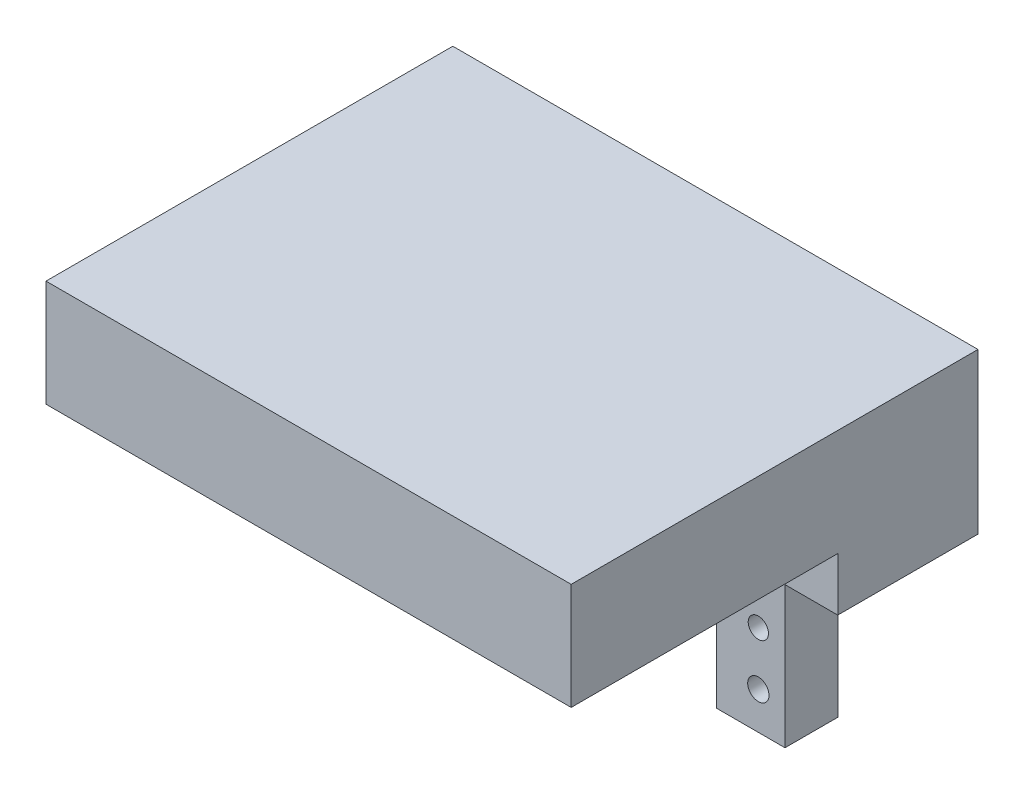
ISO-10303-21;
HEADER;
FILE_DESCRIPTION(('STEP AP214'),'2;1');
FILE_NAME('part.step','',(''),(''),'','','');
FILE_SCHEMA(('AUTOMOTIVE_DESIGN { 1 0 10303 214 1 1 1 1 }'));
ENDSEC;
DATA;
#1=APPLICATION_CONTEXT('core data for automotive mechanical design processes');
#2=APPLICATION_PROTOCOL_DEFINITION('international standard','automotive_design',2000,#1);
#3=PRODUCT_CONTEXT('',#1,'mechanical');
#4=PRODUCT('Part','Part','',(#3));
#5=PRODUCT_RELATED_PRODUCT_CATEGORY('part','',(#4));
#6=PRODUCT_DEFINITION_FORMATION('','',#4);
#7=PRODUCT_DEFINITION_CONTEXT('part definition',#1,'design');
#8=PRODUCT_DEFINITION('design','',#6,#7);
#9=PRODUCT_DEFINITION_SHAPE('','',#8);
#10=(LENGTH_UNIT() NAMED_UNIT(*) SI_UNIT(.MILLI.,.METRE.));
#11=(NAMED_UNIT(*) PLANE_ANGLE_UNIT() SI_UNIT($,.RADIAN.));
#12=(NAMED_UNIT(*) SI_UNIT($,.STERADIAN.) SOLID_ANGLE_UNIT());
#13=UNCERTAINTY_MEASURE_WITH_UNIT(LENGTH_MEASURE(1.E-05),#10,'distance_accuracy_value','');
#14=(GEOMETRIC_REPRESENTATION_CONTEXT(3) GLOBAL_UNCERTAINTY_ASSIGNED_CONTEXT((#13)) GLOBAL_UNIT_ASSIGNED_CONTEXT((#10,
#11,#12)) REPRESENTATION_CONTEXT('',''));
#15=CARTESIAN_POINT('',(0.,0.,0.));
#16=DIRECTION('',(0.,0.,1.));
#17=DIRECTION('',(1.,0.,0.));
#18=AXIS2_PLACEMENT_3D('',#15,#16,#17);
#19=CARTESIAN_POINT('',(-11.4021016393443,7.62,1.06117868852459));
#20=DIRECTION('',(0.,0.,-1.));
#21=DIRECTION('',(-1.,0.,0.));
#22=AXIS2_PLACEMENT_3D('',#19,#20,#21);
#23=PLANE('',#22);
#24=CARTESIAN_POINT('',(9.83229836065573,-4.953,1.06117868852459));
#25=DIRECTION('',(0.,0.,1.));
#26=DIRECTION('',(1.,0.,0.));
#27=AXIS2_PLACEMENT_3D('',#24,#25,#26);
#28=CIRCLE('',#27,0.508);
#29=CARTESIAN_POINT('',(10.3402983606557,-4.953,1.06117868852459));
#30=VERTEX_POINT('',#29);
#31=EDGE_CURVE('E184',#30,#30,#28,.T.);
#32=ORIENTED_EDGE('',*,*,#31,.F.);
#33=EDGE_LOOP('',(#32));
#34=FACE_BOUND('',#33,.T.);
#35=CARTESIAN_POINT('',(9.83229836065573,-2.413,1.06117868852459));
#36=DIRECTION('',(0.,0.,1.));
#37=DIRECTION('',(1.,0.,0.));
#38=AXIS2_PLACEMENT_3D('',#35,#36,#37);
#39=CIRCLE('',#38,0.482599999999999);
#40=CARTESIAN_POINT('',(10.3148983606557,-2.413,1.06117868852459));
#41=VERTEX_POINT('',#40);
#42=EDGE_CURVE('E203',#41,#41,#39,.T.);
#43=ORIENTED_EDGE('',*,*,#42,.F.);
#44=EDGE_LOOP('',(#43));
#45=FACE_BOUND('',#44,.T.);
#46=CARTESIAN_POINT('',(-6.34750163934426,-0.762,1.06117868852459));
#47=DIRECTION('',(0.,0.,1.));
#48=DIRECTION('',(1.,0.,0.));
#49=AXIS2_PLACEMENT_3D('',#46,#47,#48);
#50=CIRCLE('',#49,1.5748);
#51=CARTESIAN_POINT('',(-4.77270163934426,-0.762,1.06117868852459));
#52=VERTEX_POINT('',#51);
#53=EDGE_CURVE('E198',#52,#52,#50,.T.);
#54=ORIENTED_EDGE('',*,*,#53,.F.);
#55=EDGE_LOOP('',(#54));
#56=FACE_BOUND('',#55,.T.);
#57=DIRECTION('',(1.,0.,0.));
#58=VECTOR('',#57,1.);
#59=CARTESIAN_POINT('',(-11.4021016393443,2.54,1.06117868852459));
#60=LINE('',#59,#58);
#61=CARTESIAN_POINT('',(-11.4021016393443,2.54,1.06117868852459));
#62=VERTEX_POINT('',#61);
#63=CARTESIAN_POINT('',(13.6168983606557,2.54,1.06117868852459));
#64=VERTEX_POINT('',#63);
#65=EDGE_CURVE('E55',#62,#64,#60,.T.);
#66=ORIENTED_EDGE('',*,*,#65,.F.);
#67=DIRECTION('',(0.,-1.,0.));
#68=VECTOR('',#67,1.);
#69=CARTESIAN_POINT('',(-11.4021016393443,7.62,1.06117868852459));
#70=LINE('',#69,#68);
#71=CARTESIAN_POINT('',(-11.4021016393443,0.,1.06117868852459));
#72=VERTEX_POINT('',#71);
#73=EDGE_CURVE('E182',#62,#72,#70,.T.);
#74=ORIENTED_EDGE('',*,*,#73,.T.);
#75=DIRECTION('',(1.,0.,0.));
#76=VECTOR('',#75,1.);
#77=CARTESIAN_POINT('',(-11.4021016393443,0.,1.06117868852459));
#78=LINE('',#77,#76);
#79=CARTESIAN_POINT('',(-8.88750163934426,0.,1.06117868852459));
#80=VERTEX_POINT('',#79);
#81=EDGE_CURVE('E335',#72,#80,#78,.T.);
#82=ORIENTED_EDGE('',*,*,#81,.T.);
#83=DIRECTION('',(0.,1.,0.));
#84=VECTOR('',#83,1.);
#85=CARTESIAN_POINT('',(-8.88750163934426,-6.731,1.06117868852459));
#86=LINE('',#85,#84);
#87=CARTESIAN_POINT('',(-8.88750163934426,-6.731,1.06117868852459));
#88=VERTEX_POINT('',#87);
#89=EDGE_CURVE('E257',#88,#80,#86,.T.);
#90=ORIENTED_EDGE('',*,*,#89,.F.);
#91=DIRECTION('',(-1.,0.,0.));
#92=VECTOR('',#91,1.);
#93=CARTESIAN_POINT('',(-8.88750163934426,-6.731,1.06117868852459));
#94=LINE('',#93,#92);
#95=CARTESIAN_POINT('',(-0.251501639344265,-6.731,1.06117868852459));
#96=VERTEX_POINT('',#95);
#97=EDGE_CURVE('E252',#96,#88,#94,.T.);
#98=ORIENTED_EDGE('',*,*,#97,.F.);
#99=DIRECTION('',(0.,-1.,0.));
#100=VECTOR('',#99,1.);
#101=CARTESIAN_POINT('',(-0.251501639344266,7.62,1.06117868852459));
#102=LINE('',#101,#100);
#103=CARTESIAN_POINT('',(-0.251501639344265,0.,1.06117868852459));
#104=VERTEX_POINT('',#103);
#105=EDGE_CURVE('E232',#104,#96,#102,.T.);
#106=ORIENTED_EDGE('',*,*,#105,.F.);
#107=DIRECTION('',(-1.,0.,0.));
#108=VECTOR('',#107,1.);
#109=CARTESIAN_POINT('',(-11.4021016393443,0.,1.06117868852459));
#110=LINE('',#109,#108);
#111=CARTESIAN_POINT('',(7.85109836065573,0.,1.06117868852459));
#112=VERTEX_POINT('',#111);
#113=EDGE_CURVE('E235',#112,#104,#110,.T.);
#114=ORIENTED_EDGE('',*,*,#113,.F.);
#115=DIRECTION('',(0.,1.,0.));
#116=VECTOR('',#115,1.);
#117=CARTESIAN_POINT('',(7.85109836065573,7.62,1.06117868852459));
#118=LINE('',#117,#116);
#119=CARTESIAN_POINT('',(7.85109836065573,-6.731,1.06117868852459));
#120=VERTEX_POINT('',#119);
#121=EDGE_CURVE('E229',#120,#112,#118,.T.);
#122=ORIENTED_EDGE('',*,*,#121,.F.);
#123=CARTESIAN_POINT('',(11.1022983606557,-6.731,1.06117868852459));
#124=VERTEX_POINT('',#123);
#125=EDGE_CURVE('E253',#124,#120,#94,.T.);
#126=ORIENTED_EDGE('',*,*,#125,.F.);
#127=DIRECTION('',(0.,1.,0.));
#128=VECTOR('',#127,1.);
#129=CARTESIAN_POINT('',(11.1022983606557,-6.731,1.06117868852459));
#130=LINE('',#129,#128);
#131=CARTESIAN_POINT('',(11.1022983606557,0.,1.06117868852459));
#132=VERTEX_POINT('',#131);
#133=EDGE_CURVE('E267',#124,#132,#130,.T.);
#134=ORIENTED_EDGE('',*,*,#133,.T.);
#135=CARTESIAN_POINT('',(13.6168983606557,0.,1.06117868852459));
#136=VERTEX_POINT('',#135);
#137=EDGE_CURVE('E334',#132,#136,#78,.T.);
#138=ORIENTED_EDGE('',*,*,#137,.T.);
#139=DIRECTION('',(0.,-1.,0.));
#140=VECTOR('',#139,1.);
#141=CARTESIAN_POINT('',(13.6168983606557,7.62,1.06117868852459));
#142=LINE('',#141,#140);
#143=EDGE_CURVE('E351',#64,#136,#142,.T.);
#144=ORIENTED_EDGE('',*,*,#143,.F.);
#145=EDGE_LOOP('',(#66,#74,#82,#90,#98,#106,#114,#122,#126,#134,#138,#144));
#146=FACE_BOUND('',#145,.T.);
#147=ADVANCED_FACE('F39',(#34,#45,#56,#146),#23,.F.);
#148=CARTESIAN_POINT('',(-8.88750163934426,1.778,-1.45342131147541));
#149=DIRECTION('',(0.,0.,1.));
#150=DIRECTION('',(1.,0.,0.));
#151=AXIS2_PLACEMENT_3D('',#148,#149,#150);
#152=PLANE('',#151);
#153=CARTESIAN_POINT('',(-6.34750163934426,-0.762,-1.45342131147541));
#154=DIRECTION('',(0.,0.,1.));
#155=DIRECTION('',(1.,0.,0.));
#156=AXIS2_PLACEMENT_3D('',#153,#154,#155);
#157=CIRCLE('',#156,1.5748);
#158=CARTESIAN_POINT('',(-4.77270163934426,-0.762,-1.45342131147541));
#159=VERTEX_POINT('',#158);
#160=EDGE_CURVE('E194',#159,#159,#157,.F.);
#161=ORIENTED_EDGE('',*,*,#160,.F.);
#162=EDGE_LOOP('',(#161));
#163=FACE_BOUND('',#162,.T.);
#164=CARTESIAN_POINT('',(9.83229836065573,-2.413,-1.45342131147541));
#165=DIRECTION('',(0.,0.,1.));
#166=DIRECTION('',(1.,0.,0.));
#167=AXIS2_PLACEMENT_3D('',#164,#165,#166);
#168=CIRCLE('',#167,0.482599999999999);
#169=CARTESIAN_POINT('',(10.3148983606557,-2.413,-1.45342131147541));
#170=VERTEX_POINT('',#169);
#171=EDGE_CURVE('E202',#170,#170,#168,.F.);
#172=ORIENTED_EDGE('',*,*,#171,.F.);
#173=EDGE_LOOP('',(#172));
#174=FACE_BOUND('',#173,.T.);
#175=CARTESIAN_POINT('',(9.83229836065573,-4.953,-1.45342131147541));
#176=DIRECTION('',(0.,0.,1.));
#177=DIRECTION('',(1.,0.,0.));
#178=AXIS2_PLACEMENT_3D('',#175,#176,#177);
#179=CIRCLE('',#178,0.508);
#180=CARTESIAN_POINT('',(10.3402983606557,-4.953,-1.45342131147541));
#181=VERTEX_POINT('',#180);
#182=EDGE_CURVE('E189',#181,#181,#179,.F.);
#183=ORIENTED_EDGE('',*,*,#182,.F.);
#184=EDGE_LOOP('',(#183));
#185=FACE_BOUND('',#184,.T.);
#186=DIRECTION('',(0.,1.,0.));
#187=VECTOR('',#186,1.);
#188=CARTESIAN_POINT('',(-0.251501639344265,-6.731,-1.45342131147541));
#189=LINE('',#188,#187);
#190=CARTESIAN_POINT('',(-0.251501639344265,-6.731,-1.45342131147541));
#191=VERTEX_POINT('',#190);
#192=CARTESIAN_POINT('',(-0.251501639344265,0.,-1.45342131147541));
#193=VERTEX_POINT('',#192);
#194=EDGE_CURVE('E219',#191,#193,#189,.T.);
#195=ORIENTED_EDGE('',*,*,#194,.F.);
#196=DIRECTION('',(1.,0.,0.));
#197=VECTOR('',#196,1.);
#198=CARTESIAN_POINT('',(-8.88750163934426,-6.731,-1.45342131147541));
#199=LINE('',#198,#197);
#200=CARTESIAN_POINT('',(-8.88750163934426,-6.731,-1.45342131147541));
#201=VERTEX_POINT('',#200);
#202=EDGE_CURVE('E245',#201,#191,#199,.T.);
#203=ORIENTED_EDGE('',*,*,#202,.F.);
#204=DIRECTION('',(0.,1.,0.));
#205=VECTOR('',#204,1.);
#206=CARTESIAN_POINT('',(-8.88750163934426,-6.731,-1.45342131147541));
#207=LINE('',#206,#205);
#208=CARTESIAN_POINT('',(-8.88750163934426,0.,-1.45342131147541));
#209=VERTEX_POINT('',#208);
#210=EDGE_CURVE('E275',#201,#209,#207,.T.);
#211=ORIENTED_EDGE('',*,*,#210,.T.);
#212=DIRECTION('',(0.,-1.,0.));
#213=VECTOR('',#212,1.);
#214=CARTESIAN_POINT('',(-8.88750163934426,1.778,-1.45342131147541));
#215=LINE('',#214,#213);
#216=CARTESIAN_POINT('',(-8.88750163934426,1.778,-1.45342131147541));
#217=VERTEX_POINT('',#216);
#218=EDGE_CURVE('E315',#217,#209,#215,.T.);
#219=ORIENTED_EDGE('',*,*,#218,.F.);
#220=DIRECTION('',(-1.,0.,0.));
#221=VECTOR('',#220,1.);
#222=CARTESIAN_POINT('',(-8.88750163934426,1.778,-1.45342131147541));
#223=LINE('',#222,#221);
#224=CARTESIAN_POINT('',(11.1022983606557,1.778,-1.45342131147541));
#225=VERTEX_POINT('',#224);
#226=EDGE_CURVE('E284',#225,#217,#223,.T.);
#227=ORIENTED_EDGE('',*,*,#226,.F.);
#228=DIRECTION('',(0.,-1.,0.));
#229=VECTOR('',#228,1.);
#230=CARTESIAN_POINT('',(11.1022983606557,1.778,-1.45342131147541));
#231=LINE('',#230,#229);
#232=CARTESIAN_POINT('',(11.1022983606557,0.,-1.45342131147541));
#233=VERTEX_POINT('',#232);
#234=EDGE_CURVE('E297',#225,#233,#231,.T.);
#235=ORIENTED_EDGE('',*,*,#234,.T.);
#236=DIRECTION('',(0.,1.,0.));
#237=VECTOR('',#236,1.);
#238=CARTESIAN_POINT('',(11.1022983606557,-6.731,-1.45342131147541));
#239=LINE('',#238,#237);
#240=CARTESIAN_POINT('',(11.1022983606557,-6.731,-1.45342131147541));
#241=VERTEX_POINT('',#240);
#242=EDGE_CURVE('E271',#241,#233,#239,.T.);
#243=ORIENTED_EDGE('',*,*,#242,.F.);
#244=CARTESIAN_POINT('',(7.85109836065573,-6.731,-1.45342131147541));
#245=VERTEX_POINT('',#244);
#246=EDGE_CURVE('E243',#245,#241,#199,.T.);
#247=ORIENTED_EDGE('',*,*,#246,.F.);
#248=DIRECTION('',(0.,-1.,0.));
#249=VECTOR('',#248,1.);
#250=CARTESIAN_POINT('',(7.85109836065573,-6.731,-1.45342131147541));
#251=LINE('',#250,#249);
#252=CARTESIAN_POINT('',(7.85109836065573,0.,-1.45342131147541));
#253=VERTEX_POINT('',#252);
#254=EDGE_CURVE('E63',#253,#245,#251,.T.);
#255=ORIENTED_EDGE('',*,*,#254,.F.);
#256=DIRECTION('',(1.,0.,0.));
#257=VECTOR('',#256,1.);
#258=CARTESIAN_POINT('',(-0.251501639344265,0.,-1.45342131147541));
#259=LINE('',#258,#257);
#260=EDGE_CURVE('E215',#193,#253,#259,.T.);
#261=ORIENTED_EDGE('',*,*,#260,.F.);
#262=EDGE_LOOP('',(#195,#203,#211,#219,#227,#235,#243,#247,#255,#261));
#263=FACE_BOUND('',#262,.T.);
#264=ADVANCED_FACE('F412',(#163,#174,#185,#263),#152,.F.);
#265=CARTESIAN_POINT('',(0.,-6.731,0.));
#266=DIRECTION('',(0.,1.,0.));
#267=DIRECTION('',(0.,0.,1.));
#268=AXIS2_PLACEMENT_3D('',#265,#266,#267);
#269=PLANE('',#268);
#270=DIRECTION('',(0.,0.,-1.));
#271=VECTOR('',#270,1.);
#272=CARTESIAN_POINT('',(-0.251501639344265,-6.731,0.));
#273=LINE('',#272,#271);
#274=EDGE_CURVE('E11',#96,#191,#273,.T.);
#275=ORIENTED_EDGE('',*,*,#274,.F.);
#276=ORIENTED_EDGE('',*,*,#97,.T.);
#277=DIRECTION('',(0.,0.,-1.));
#278=VECTOR('',#277,1.);
#279=CARTESIAN_POINT('',(-8.88750163934426,-6.731,-1.45342131147541));
#280=LINE('',#279,#278);
#281=EDGE_CURVE('E239',#88,#201,#280,.T.);
#282=ORIENTED_EDGE('',*,*,#281,.T.);
#283=ORIENTED_EDGE('',*,*,#202,.T.);
#284=EDGE_LOOP('',(#275,#276,#282,#283));
#285=FACE_BOUND('',#284,.T.);
#286=ADVANCED_FACE('F401',(#285),#269,.F.);
#287=DIRECTION('',(0.,0.,1.));
#288=VECTOR('',#287,1.);
#289=CARTESIAN_POINT('',(7.85109836065573,-6.731,0.));
#290=LINE('',#289,#288);
#291=EDGE_CURVE('E48',#245,#120,#290,.T.);
#292=ORIENTED_EDGE('',*,*,#291,.F.);
#293=ORIENTED_EDGE('',*,*,#246,.T.);
#294=DIRECTION('',(0.,0.,1.));
#295=VECTOR('',#294,1.);
#296=CARTESIAN_POINT('',(11.1022983606557,-6.731,-1.45342131147541));
#297=LINE('',#296,#295);
#298=EDGE_CURVE('E249',#241,#124,#297,.T.);
#299=ORIENTED_EDGE('',*,*,#298,.T.);
#300=ORIENTED_EDGE('',*,*,#125,.T.);
#301=EDGE_LOOP('',(#292,#293,#299,#300));
#302=FACE_BOUND('',#301,.T.);
#303=ADVANCED_FACE('F364',(#302),#269,.F.);
#304=CARTESIAN_POINT('',(0.,0.,0.));
#305=DIRECTION('',(0.,1.,0.));
#306=DIRECTION('',(0.,0.,1.));
#307=AXIS2_PLACEMENT_3D('',#304,#305,#306);
#308=PLANE('',#307);
#309=DIRECTION('',(0.,0.,-1.));
#310=VECTOR('',#309,1.);
#311=CARTESIAN_POINT('',(-8.88750163934426,0.,-1.45342131147541));
#312=LINE('',#311,#310);
#313=EDGE_CURVE('E238',#80,#209,#312,.T.);
#314=ORIENTED_EDGE('',*,*,#313,.F.);
#315=ORIENTED_EDGE('',*,*,#81,.F.);
#316=DIRECTION('',(0.,0.,1.));
#317=VECTOR('',#316,1.);
#318=CARTESIAN_POINT('',(-11.4021016393443,0.,-5.61902131147541));
#319=LINE('',#318,#317);
#320=CARTESIAN_POINT('',(-11.4021016393443,0.,-5.61902131147541));
#321=VERTEX_POINT('',#320);
#322=EDGE_CURVE('E311',#321,#72,#319,.T.);
#323=ORIENTED_EDGE('',*,*,#322,.F.);
#324=DIRECTION('',(-1.,0.,0.));
#325=VECTOR('',#324,1.);
#326=CARTESIAN_POINT('',(-11.4021016393443,0.,-5.61902131147541));
#327=LINE('',#326,#325);
#328=CARTESIAN_POINT('',(13.6168983606557,0.,-5.61902131147541));
#329=VERTEX_POINT('',#328);
#330=EDGE_CURVE('E325',#329,#321,#327,.T.);
#331=ORIENTED_EDGE('',*,*,#330,.F.);
#332=DIRECTION('',(0.,0.,-1.));
#333=VECTOR('',#332,1.);
#334=CARTESIAN_POINT('',(13.6168983606557,0.,-5.61902131147541));
#335=LINE('',#334,#333);
#336=EDGE_CURVE('E339',#136,#329,#335,.T.);
#337=ORIENTED_EDGE('',*,*,#336,.F.);
#338=ORIENTED_EDGE('',*,*,#137,.F.);
#339=DIRECTION('',(0.,0.,1.));
#340=VECTOR('',#339,1.);
#341=CARTESIAN_POINT('',(11.1022983606557,0.,-1.45342131147541));
#342=LINE('',#341,#340);
#343=EDGE_CURVE('E244',#233,#132,#342,.T.);
#344=ORIENTED_EDGE('',*,*,#343,.F.);
#345=DIRECTION('',(0.,0.,1.));
#346=VECTOR('',#345,1.);
#347=CARTESIAN_POINT('',(11.1022983606557,0.,-3.10442131147541));
#348=LINE('',#347,#346);
#349=CARTESIAN_POINT('',(11.1022983606557,0.,-3.10442131147541));
#350=VERTEX_POINT('',#349);
#351=EDGE_CURVE('E279',#350,#233,#348,.T.);
#352=ORIENTED_EDGE('',*,*,#351,.F.);
#353=DIRECTION('',(1.,0.,0.));
#354=VECTOR('',#353,1.);
#355=CARTESIAN_POINT('',(-8.88750163934426,0.,-3.10442131147541));
#356=LINE('',#355,#354);
#357=CARTESIAN_POINT('',(-8.88750163934426,0.,-3.10442131147541));
#358=VERTEX_POINT('',#357);
#359=EDGE_CURVE('E285',#358,#350,#356,.T.);
#360=ORIENTED_EDGE('',*,*,#359,.F.);
#361=DIRECTION('',(0.,0.,-1.));
#362=VECTOR('',#361,1.);
#363=CARTESIAN_POINT('',(-8.88750163934426,0.,-3.10442131147541));
#364=LINE('',#363,#362);
#365=EDGE_CURVE('E301',#209,#358,#364,.T.);
#366=ORIENTED_EDGE('',*,*,#365,.F.);
#367=EDGE_LOOP('',(#314,#315,#323,#331,#337,#338,#344,#352,#360,#366));
#368=FACE_BOUND('',#367,.T.);
#369=ADVANCED_FACE('F375',(#368),#308,.F.);
#370=CARTESIAN_POINT('',(-11.4021016393443,7.62,-5.61902131147541));
#371=DIRECTION('',(1.,0.,0.));
#372=DIRECTION('',(0.,0.,-1.));
#373=AXIS2_PLACEMENT_3D('',#370,#371,#372);
#374=PLANE('',#373);
#375=ORIENTED_EDGE('',*,*,#322,.T.);
#376=ORIENTED_EDGE('',*,*,#73,.F.);
#377=DIRECTION('',(0.,0.,-1.));
#378=VECTOR('',#377,1.);
#379=CARTESIAN_POINT('',(-11.4021016393443,2.54,13.7611786885246));
#380=LINE('',#379,#378);
#381=CARTESIAN_POINT('',(-11.4021016393443,2.54,13.7611786885246));
#382=VERTEX_POINT('',#381);
#383=EDGE_CURVE('E162',#382,#62,#380,.T.);
#384=ORIENTED_EDGE('',*,*,#383,.F.);
#385=DIRECTION('',(0.,-1.,0.));
#386=VECTOR('',#385,1.);
#387=CARTESIAN_POINT('',(-11.4021016393443,7.62,13.7611786885246));
#388=LINE('',#387,#386);
#389=CARTESIAN_POINT('',(-11.4021016393443,7.62,13.7611786885246));
#390=VERTEX_POINT('',#389);
#391=EDGE_CURVE('E170',#390,#382,#388,.T.);
#392=ORIENTED_EDGE('',*,*,#391,.F.);
#393=DIRECTION('',(0.,0.,1.));
#394=VECTOR('',#393,1.);
#395=CARTESIAN_POINT('',(-11.4021016393443,7.62,-5.61902131147541));
#396=LINE('',#395,#394);
#397=CARTESIAN_POINT('',(-11.4021016393443,7.62,-5.61902131147541));
#398=VERTEX_POINT('',#397);
#399=EDGE_CURVE('E321',#398,#390,#396,.T.);
#400=ORIENTED_EDGE('',*,*,#399,.F.);
#401=DIRECTION('',(0.,-1.,0.));
#402=VECTOR('',#401,1.);
#403=CARTESIAN_POINT('',(-11.4021016393443,7.62,-5.61902131147541));
#404=LINE('',#403,#402);
#405=EDGE_CURVE('E331',#398,#321,#404,.T.);
#406=ORIENTED_EDGE('',*,*,#405,.T.);
#407=EDGE_LOOP('',(#375,#376,#384,#392,#400,#406));
#408=FACE_BOUND('',#407,.T.);
#409=ADVANCED_FACE('F41',(#408),#374,.F.);
#410=CARTESIAN_POINT('',(13.6168983606557,7.62,-5.61902131147541));
#411=DIRECTION('',(-1.,0.,0.));
#412=DIRECTION('',(0.,0.,1.));
#413=AXIS2_PLACEMENT_3D('',#410,#411,#412);
#414=PLANE('',#413);
#415=ORIENTED_EDGE('',*,*,#336,.T.);
#416=DIRECTION('',(0.,-1.,0.));
#417=VECTOR('',#416,1.);
#418=CARTESIAN_POINT('',(13.6168983606557,7.62,-5.61902131147541));
#419=LINE('',#418,#417);
#420=CARTESIAN_POINT('',(13.6168983606557,7.62,-5.61902131147541));
#421=VERTEX_POINT('',#420);
#422=EDGE_CURVE('E347',#421,#329,#419,.T.);
#423=ORIENTED_EDGE('',*,*,#422,.F.);
#424=DIRECTION('',(0.,0.,-1.));
#425=VECTOR('',#424,1.);
#426=CARTESIAN_POINT('',(13.6168983606557,7.62,-5.61902131147541));
#427=LINE('',#426,#425);
#428=CARTESIAN_POINT('',(13.6168983606557,7.62,13.7611786885246));
#429=VERTEX_POINT('',#428);
#430=EDGE_CURVE('E324',#429,#421,#427,.T.);
#431=ORIENTED_EDGE('',*,*,#430,.F.);
#432=DIRECTION('',(0.,1.,0.));
#433=VECTOR('',#432,1.);
#434=CARTESIAN_POINT('',(13.6168983606557,7.62,13.7611786885246));
#435=LINE('',#434,#433);
#436=CARTESIAN_POINT('',(13.6168983606557,2.54,13.7611786885246));
#437=VERTEX_POINT('',#436);
#438=EDGE_CURVE('E169',#437,#429,#435,.T.);
#439=ORIENTED_EDGE('',*,*,#438,.F.);
#440=DIRECTION('',(0.,0.,-1.));
#441=VECTOR('',#440,1.);
#442=CARTESIAN_POINT('',(13.6168983606557,2.54,13.7611786885246));
#443=LINE('',#442,#441);
#444=EDGE_CURVE('E164',#437,#64,#443,.T.);
#445=ORIENTED_EDGE('',*,*,#444,.T.);
#446=ORIENTED_EDGE('',*,*,#143,.T.);
#447=EDGE_LOOP('',(#415,#423,#431,#439,#445,#446));
#448=FACE_BOUND('',#447,.T.);
#449=ADVANCED_FACE('F379',(#448),#414,.F.);
#450=CARTESIAN_POINT('',(-11.4021016393443,7.62,-5.61902131147541));
#451=DIRECTION('',(0.,0.,1.));
#452=DIRECTION('',(1.,0.,0.));
#453=AXIS2_PLACEMENT_3D('',#450,#451,#452);
#454=PLANE('',#453);
#455=ORIENTED_EDGE('',*,*,#330,.T.);
#456=ORIENTED_EDGE('',*,*,#405,.F.);
#457=DIRECTION('',(-1.,0.,0.));
#458=VECTOR('',#457,1.);
#459=CARTESIAN_POINT('',(-11.4021016393443,7.62,-5.61902131147541));
#460=LINE('',#459,#458);
#461=EDGE_CURVE('E328',#421,#398,#460,.T.);
#462=ORIENTED_EDGE('',*,*,#461,.F.);
#463=ORIENTED_EDGE('',*,*,#422,.T.);
#464=EDGE_LOOP('',(#455,#456,#462,#463));
#465=FACE_BOUND('',#464,.T.);
#466=ADVANCED_FACE('F382',(#465),#454,.F.);
#467=CARTESIAN_POINT('',(0.,7.62,0.));
#468=DIRECTION('',(0.,1.,0.));
#469=DIRECTION('',(0.,0.,1.));
#470=AXIS2_PLACEMENT_3D('',#467,#468,#469);
#471=PLANE('',#470);
#472=ORIENTED_EDGE('',*,*,#399,.T.);
#473=DIRECTION('',(-1.,0.,0.));
#474=VECTOR('',#473,1.);
#475=CARTESIAN_POINT('',(-11.4021016393443,7.62,13.7611786885246));
#476=LINE('',#475,#474);
#477=EDGE_CURVE('E176',#429,#390,#476,.T.);
#478=ORIENTED_EDGE('',*,*,#477,.F.);
#479=ORIENTED_EDGE('',*,*,#430,.T.);
#480=ORIENTED_EDGE('',*,*,#461,.T.);
#481=EDGE_LOOP('',(#472,#478,#479,#480));
#482=FACE_BOUND('',#481,.T.);
#483=ADVANCED_FACE('F385',(#482),#471,.T.);
#484=CARTESIAN_POINT('',(11.1022983606557,1.778,-3.10442131147541));
#485=DIRECTION('',(1.,0.,0.));
#486=DIRECTION('',(0.,0.,-1.));
#487=AXIS2_PLACEMENT_3D('',#484,#485,#486);
#488=PLANE('',#487);
#489=ORIENTED_EDGE('',*,*,#351,.T.);
#490=ORIENTED_EDGE('',*,*,#234,.F.);
#491=DIRECTION('',(0.,0.,1.));
#492=VECTOR('',#491,1.);
#493=CARTESIAN_POINT('',(11.1022983606557,1.778,-3.10442131147541));
#494=LINE('',#493,#492);
#495=CARTESIAN_POINT('',(11.1022983606557,1.778,-3.10442131147541));
#496=VERTEX_POINT('',#495);
#497=EDGE_CURVE('E280',#496,#225,#494,.T.);
#498=ORIENTED_EDGE('',*,*,#497,.F.);
#499=DIRECTION('',(0.,-1.,0.));
#500=VECTOR('',#499,1.);
#501=CARTESIAN_POINT('',(11.1022983606557,1.778,-3.10442131147541));
#502=LINE('',#501,#500);
#503=EDGE_CURVE('E308',#496,#350,#502,.T.);
#504=ORIENTED_EDGE('',*,*,#503,.T.);
#505=EDGE_LOOP('',(#489,#490,#498,#504));
#506=FACE_BOUND('',#505,.T.);
#507=ADVANCED_FACE('F416',(#506),#488,.F.);
#508=CARTESIAN_POINT('',(-8.88750163934426,1.778,-3.10442131147541));
#509=DIRECTION('',(0.,0.,-1.));
#510=DIRECTION('',(-1.,0.,0.));
#511=AXIS2_PLACEMENT_3D('',#508,#509,#510);
#512=PLANE('',#511);
#513=ORIENTED_EDGE('',*,*,#359,.T.);
#514=ORIENTED_EDGE('',*,*,#503,.F.);
#515=DIRECTION('',(1.,0.,0.));
#516=VECTOR('',#515,1.);
#517=CARTESIAN_POINT('',(-8.88750163934426,1.778,-3.10442131147541));
#518=LINE('',#517,#516);
#519=CARTESIAN_POINT('',(-8.88750163934426,1.778,-3.10442131147541));
#520=VERTEX_POINT('',#519);
#521=EDGE_CURVE('E293',#520,#496,#518,.T.);
#522=ORIENTED_EDGE('',*,*,#521,.F.);
#523=DIRECTION('',(0.,-1.,0.));
#524=VECTOR('',#523,1.);
#525=CARTESIAN_POINT('',(-8.88750163934426,1.778,-3.10442131147541));
#526=LINE('',#525,#524);
#527=EDGE_CURVE('E312',#520,#358,#526,.T.);
#528=ORIENTED_EDGE('',*,*,#527,.T.);
#529=EDGE_LOOP('',(#513,#514,#522,#528));
#530=FACE_BOUND('',#529,.T.);
#531=ADVANCED_FACE('F420',(#530),#512,.F.);
#532=CARTESIAN_POINT('',(-8.88750163934426,1.778,-3.10442131147541));
#533=DIRECTION('',(-1.,0.,0.));
#534=DIRECTION('',(0.,0.,1.));
#535=AXIS2_PLACEMENT_3D('',#532,#533,#534);
#536=PLANE('',#535);
#537=ORIENTED_EDGE('',*,*,#365,.T.);
#538=ORIENTED_EDGE('',*,*,#527,.F.);
#539=DIRECTION('',(0.,0.,-1.));
#540=VECTOR('',#539,1.);
#541=CARTESIAN_POINT('',(-8.88750163934426,1.778,-3.10442131147541));
#542=LINE('',#541,#540);
#543=EDGE_CURVE('E289',#217,#520,#542,.T.);
#544=ORIENTED_EDGE('',*,*,#543,.F.);
#545=ORIENTED_EDGE('',*,*,#218,.T.);
#546=EDGE_LOOP('',(#537,#538,#544,#545));
#547=FACE_BOUND('',#546,.T.);
#548=ADVANCED_FACE('F424',(#547),#536,.F.);
#549=CARTESIAN_POINT('',(0.,1.778,0.));
#550=DIRECTION('',(0.,1.,0.));
#551=DIRECTION('',(0.,0.,1.));
#552=AXIS2_PLACEMENT_3D('',#549,#550,#551);
#553=PLANE('',#552);
#554=ORIENTED_EDGE('',*,*,#497,.T.);
#555=ORIENTED_EDGE('',*,*,#226,.T.);
#556=ORIENTED_EDGE('',*,*,#543,.T.);
#557=ORIENTED_EDGE('',*,*,#521,.T.);
#558=EDGE_LOOP('',(#554,#555,#556,#557));
#559=FACE_BOUND('',#558,.T.);
#560=ADVANCED_FACE('F426',(#559),#553,.F.);
#561=CARTESIAN_POINT('',(-8.88750163934426,-6.731,-1.45342131147541));
#562=DIRECTION('',(1.,0.,0.));
#563=DIRECTION('',(0.,0.,-1.));
#564=AXIS2_PLACEMENT_3D('',#561,#562,#563);
#565=PLANE('',#564);
#566=ORIENTED_EDGE('',*,*,#313,.T.);
#567=ORIENTED_EDGE('',*,*,#210,.F.);
#568=ORIENTED_EDGE('',*,*,#281,.F.);
#569=ORIENTED_EDGE('',*,*,#89,.T.);
#570=EDGE_LOOP('',(#566,#567,#568,#569));
#571=FACE_BOUND('',#570,.T.);
#572=ADVANCED_FACE('F397',(#571),#565,.F.);
#573=CARTESIAN_POINT('',(11.1022983606557,-6.731,-1.45342131147541));
#574=DIRECTION('',(-1.,0.,0.));
#575=DIRECTION('',(0.,0.,1.));
#576=AXIS2_PLACEMENT_3D('',#573,#574,#575);
#577=PLANE('',#576);
#578=ORIENTED_EDGE('',*,*,#343,.T.);
#579=ORIENTED_EDGE('',*,*,#133,.F.);
#580=ORIENTED_EDGE('',*,*,#298,.F.);
#581=ORIENTED_EDGE('',*,*,#242,.T.);
#582=EDGE_LOOP('',(#578,#579,#580,#581));
#583=FACE_BOUND('',#582,.T.);
#584=ADVANCED_FACE('F369',(#583),#577,.F.);
#585=CARTESIAN_POINT('',(-0.251501639344265,0.,1.06119068852459));
#586=DIRECTION('',(0.,-1.,0.));
#587=DIRECTION('',(0.,0.,-1.));
#588=AXIS2_PLACEMENT_3D('',#585,#586,#587);
#589=PLANE('',#588);
#590=ORIENTED_EDGE('',*,*,#113,.T.);
#591=DIRECTION('',(0.,0.,-1.));
#592=VECTOR('',#591,1.);
#593=CARTESIAN_POINT('',(-0.251501639344265,0.,1.06119068852459));
#594=LINE('',#593,#592);
#595=EDGE_CURVE('E223',#104,#193,#594,.T.);
#596=ORIENTED_EDGE('',*,*,#595,.T.);
#597=ORIENTED_EDGE('',*,*,#260,.T.);
#598=DIRECTION('',(0.,0.,-1.));
#599=VECTOR('',#598,1.);
#600=CARTESIAN_POINT('',(7.85109836065573,0.,1.06119068852459));
#601=LINE('',#600,#599);
#602=EDGE_CURVE('E226',#112,#253,#601,.T.);
#603=ORIENTED_EDGE('',*,*,#602,.F.);
#604=EDGE_LOOP('',(#590,#596,#597,#603));
#605=FACE_BOUND('',#604,.T.);
#606=ADVANCED_FACE('F410',(#605),#589,.T.);
#607=CARTESIAN_POINT('',(-0.251501639344265,-6.731,1.06119068852459));
#608=DIRECTION('',(1.,0.,0.));
#609=DIRECTION('',(0.,0.,-1.));
#610=AXIS2_PLACEMENT_3D('',#607,#608,#609);
#611=PLANE('',#610);
#612=ORIENTED_EDGE('',*,*,#105,.T.);
#613=ORIENTED_EDGE('',*,*,#274,.T.);
#614=ORIENTED_EDGE('',*,*,#194,.T.);
#615=ORIENTED_EDGE('',*,*,#595,.F.);
#616=EDGE_LOOP('',(#612,#613,#614,#615));
#617=FACE_BOUND('',#616,.T.);
#618=ADVANCED_FACE('F406',(#617),#611,.T.);
#619=CARTESIAN_POINT('',(7.85109836065573,-6.731,1.06119068852459));
#620=DIRECTION('',(-1.,0.,0.));
#621=DIRECTION('',(0.,0.,1.));
#622=AXIS2_PLACEMENT_3D('',#619,#620,#621);
#623=PLANE('',#622);
#624=ORIENTED_EDGE('',*,*,#121,.T.);
#625=ORIENTED_EDGE('',*,*,#602,.T.);
#626=ORIENTED_EDGE('',*,*,#254,.T.);
#627=ORIENTED_EDGE('',*,*,#291,.T.);
#628=EDGE_LOOP('',(#624,#625,#626,#627));
#629=FACE_BOUND('',#628,.T.);
#630=ADVANCED_FACE('F357',(#629),#623,.T.);
#631=CARTESIAN_POINT('',(9.83229836065573,-4.953,-5.62002131147541));
#632=DIRECTION('',(0.,0.,1.));
#633=DIRECTION('',(1.,0.,0.));
#634=AXIS2_PLACEMENT_3D('',#631,#632,#633);
#635=CYLINDRICAL_SURFACE('',#634,0.508);
#636=ORIENTED_EDGE('',*,*,#31,.T.);
#637=EDGE_LOOP('',(#636));
#638=FACE_BOUND('',#637,.T.);
#639=ORIENTED_EDGE('',*,*,#182,.T.);
#640=EDGE_LOOP('',(#639));
#641=FACE_BOUND('',#640,.T.);
#642=ADVANCED_FACE('F526',(#638,#641),#635,.F.);
#643=CARTESIAN_POINT('',(9.83229836065573,-2.413,-5.62002131147541));
#644=DIRECTION('',(0.,0.,1.));
#645=DIRECTION('',(1.,0.,0.));
#646=AXIS2_PLACEMENT_3D('',#643,#644,#645);
#647=CYLINDRICAL_SURFACE('',#646,0.482599999999999);
#648=ORIENTED_EDGE('',*,*,#42,.T.);
#649=EDGE_LOOP('',(#648));
#650=FACE_BOUND('',#649,.T.);
#651=ORIENTED_EDGE('',*,*,#171,.T.);
#652=EDGE_LOOP('',(#651));
#653=FACE_BOUND('',#652,.T.);
#654=ADVANCED_FACE('F540',(#650,#653),#647,.F.);
#655=CARTESIAN_POINT('',(-6.34750163934426,-0.762,-5.62002131147541));
#656=DIRECTION('',(0.,0.,1.));
#657=DIRECTION('',(1.,0.,0.));
#658=AXIS2_PLACEMENT_3D('',#655,#656,#657);
#659=CYLINDRICAL_SURFACE('',#658,1.5748);
#660=ORIENTED_EDGE('',*,*,#53,.T.);
#661=EDGE_LOOP('',(#660));
#662=FACE_BOUND('',#661,.T.);
#663=ORIENTED_EDGE('',*,*,#160,.T.);
#664=EDGE_LOOP('',(#663));
#665=FACE_BOUND('',#664,.T.);
#666=ADVANCED_FACE('F550',(#662,#665),#659,.F.);
#667=CARTESIAN_POINT('',(-11.4021016393443,2.54,13.7611786885246));
#668=DIRECTION('',(0.,1.,0.));
#669=DIRECTION('',(0.,0.,1.));
#670=AXIS2_PLACEMENT_3D('',#667,#668,#669);
#671=PLANE('',#670);
#672=ORIENTED_EDGE('',*,*,#65,.T.);
#673=ORIENTED_EDGE('',*,*,#444,.F.);
#674=DIRECTION('',(1.,0.,0.));
#675=VECTOR('',#674,1.);
#676=CARTESIAN_POINT('',(-11.4021016393443,2.54,13.7611786885246));
#677=LINE('',#676,#675);
#678=EDGE_CURVE('E158',#382,#437,#677,.T.);
#679=ORIENTED_EDGE('',*,*,#678,.F.);
#680=ORIENTED_EDGE('',*,*,#383,.T.);
#681=EDGE_LOOP('',(#672,#673,#679,#680));
#682=FACE_BOUND('',#681,.T.);
#683=ADVANCED_FACE('F160',(#682),#671,.F.);
#684=CARTESIAN_POINT('',(0.,0.,13.7611786885246));
#685=DIRECTION('',(0.,0.,1.));
#686=DIRECTION('',(1.,0.,0.));
#687=AXIS2_PLACEMENT_3D('',#684,#685,#686);
#688=PLANE('',#687);
#689=ORIENTED_EDGE('',*,*,#391,.T.);
#690=ORIENTED_EDGE('',*,*,#678,.T.);
#691=ORIENTED_EDGE('',*,*,#438,.T.);
#692=ORIENTED_EDGE('',*,*,#477,.T.);
#693=EDGE_LOOP('',(#689,#690,#691,#692));
#694=FACE_BOUND('',#693,.T.);
#695=ADVANCED_FACE('F174',(#694),#688,.T.);
#696=CLOSED_SHELL('',(#147,#264,#286,#303,#369,#409,#449,#466,#483,#507,#531,#548,#560,#572,
#584,#606,#618,#630,#642,#654,#666,#683,#695));
#697=MANIFOLD_SOLID_BREP('B2',#696);
#698=ADVANCED_BREP_SHAPE_REPRESENTATION('',(#18,#697),#14);
#699=SHAPE_DEFINITION_REPRESENTATION(#9,#698);
ENDSEC;
END-ISO-10303-21;
